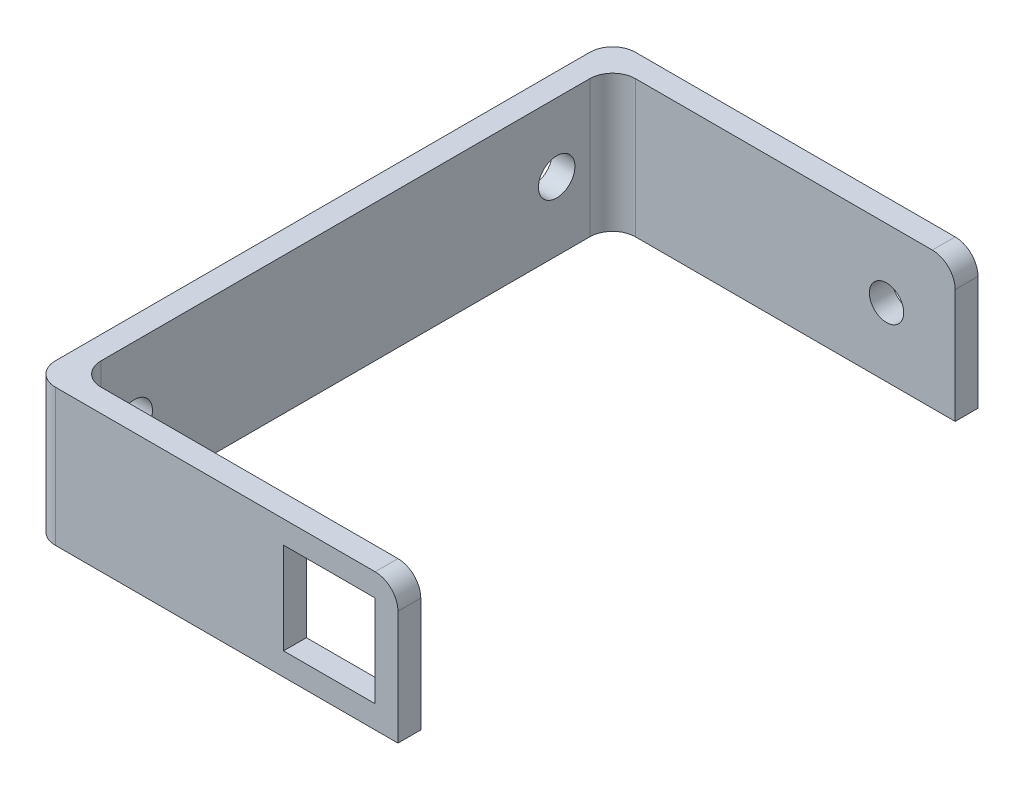
ISO-10303-21;
HEADER;
FILE_DESCRIPTION(('STEP AP214'),'2;1');
FILE_NAME('part.step','',(''),(''),'','','');
FILE_SCHEMA(('AUTOMOTIVE_DESIGN { 1 0 10303 214 1 1 1 1 }'));
ENDSEC;
DATA;
#1=APPLICATION_CONTEXT('core data for automotive mechanical design processes');
#2=APPLICATION_PROTOCOL_DEFINITION('international standard','automotive_design',2000,#1);
#3=PRODUCT_CONTEXT('',#1,'mechanical');
#4=PRODUCT('Part','Part','',(#3));
#5=PRODUCT_RELATED_PRODUCT_CATEGORY('part','',(#4));
#6=PRODUCT_DEFINITION_FORMATION('','',#4);
#7=PRODUCT_DEFINITION_CONTEXT('part definition',#1,'design');
#8=PRODUCT_DEFINITION('design','',#6,#7);
#9=PRODUCT_DEFINITION_SHAPE('','',#8);
#10=(LENGTH_UNIT() NAMED_UNIT(*) SI_UNIT(.MILLI.,.METRE.));
#11=(NAMED_UNIT(*) PLANE_ANGLE_UNIT() SI_UNIT($,.RADIAN.));
#12=(NAMED_UNIT(*) SI_UNIT($,.STERADIAN.) SOLID_ANGLE_UNIT());
#13=UNCERTAINTY_MEASURE_WITH_UNIT(LENGTH_MEASURE(1.E-05),#10,'distance_accuracy_value','');
#14=(GEOMETRIC_REPRESENTATION_CONTEXT(3) GLOBAL_UNCERTAINTY_ASSIGNED_CONTEXT((#13)) GLOBAL_UNIT_ASSIGNED_CONTEXT((#10,
#11,#12)) REPRESENTATION_CONTEXT('',''));
#15=CARTESIAN_POINT('',(0.,0.,0.));
#16=DIRECTION('',(0.,0.,1.));
#17=DIRECTION('',(1.,0.,0.));
#18=AXIS2_PLACEMENT_3D('',#15,#16,#17);
#19=CARTESIAN_POINT('',(0.,12.,-2.));
#20=DIRECTION('',(-1.,0.,0.));
#21=DIRECTION('',(0.,0.,1.));
#22=AXIS2_PLACEMENT_3D('',#19,#20,#21);
#23=PLANE('',#22);
#24=DIRECTION('',(0.,-1.,0.));
#25=VECTOR('',#24,1.);
#26=CARTESIAN_POINT('',(0.,12.,-2.));
#27=LINE('',#26,#25);
#28=CARTESIAN_POINT('',(0.,10.,-2.));
#29=VERTEX_POINT('',#28);
#30=CARTESIAN_POINT('',(0.,0.,-2.));
#31=VERTEX_POINT('',#30);
#32=EDGE_CURVE('E262',#29,#31,#27,.T.);
#33=ORIENTED_EDGE('',*,*,#32,.F.);
#34=DIRECTION('',(0.,0.,-1.));
#35=VECTOR('',#34,1.);
#36=CARTESIAN_POINT('',(0.,10.,-2.));
#37=LINE('',#36,#35);
#38=CARTESIAN_POINT('',(0.,10.,0.));
#39=VERTEX_POINT('',#38);
#40=EDGE_CURVE('E269',#29,#39,#37,.F.);
#41=ORIENTED_EDGE('',*,*,#40,.T.);
#42=DIRECTION('',(0.,-1.,0.));
#43=VECTOR('',#42,1.);
#44=CARTESIAN_POINT('',(0.,12.,0.));
#45=LINE('',#44,#43);
#46=CARTESIAN_POINT('',(0.,0.,0.));
#47=VERTEX_POINT('',#46);
#48=EDGE_CURVE('E236',#39,#47,#45,.T.);
#49=ORIENTED_EDGE('',*,*,#48,.T.);
#50=DIRECTION('',(0.,0.,-1.));
#51=VECTOR('',#50,1.);
#52=CARTESIAN_POINT('',(0.,0.,-2.));
#53=LINE('',#52,#51);
#54=EDGE_CURVE('E220',#47,#31,#53,.T.);
#55=ORIENTED_EDGE('',*,*,#54,.T.);
#56=EDGE_LOOP('',(#33,#41,#49,#55));
#57=FACE_BOUND('',#56,.T.);
#58=ADVANCED_FACE('F34',(#57),#23,.F.);
#59=CARTESIAN_POINT('',(-30.,12.,-2.));
#60=DIRECTION('',(0.,0.,1.));
#61=DIRECTION('',(1.,0.,0.));
#62=AXIS2_PLACEMENT_3D('',#59,#60,#61);
#63=PLANE('',#62);
#64=DIRECTION('',(1.,0.,0.));
#65=VECTOR('',#64,1.);
#66=CARTESIAN_POINT('',(-10.02,1.99,-2.));
#67=LINE('',#66,#65);
#68=CARTESIAN_POINT('',(-10.02,1.99,-2.));
#69=VERTEX_POINT('',#68);
#70=CARTESIAN_POINT('',(-2.,1.99,-2.));
#71=VERTEX_POINT('',#70);
#72=EDGE_CURVE('E171',#69,#71,#67,.T.);
#73=ORIENTED_EDGE('',*,*,#72,.T.);
#74=DIRECTION('',(0.,1.,0.));
#75=VECTOR('',#74,1.);
#76=CARTESIAN_POINT('',(-2.,1.99,-2.));
#77=LINE('',#76,#75);
#78=CARTESIAN_POINT('',(-2.,10.01,-2.));
#79=VERTEX_POINT('',#78);
#80=EDGE_CURVE('E163',#71,#79,#77,.T.);
#81=ORIENTED_EDGE('',*,*,#80,.T.);
#82=DIRECTION('',(-1.,0.,0.));
#83=VECTOR('',#82,1.);
#84=CARTESIAN_POINT('',(-10.02,10.01,-2.));
#85=LINE('',#84,#83);
#86=CARTESIAN_POINT('',(-10.02,10.01,-2.));
#87=VERTEX_POINT('',#86);
#88=EDGE_CURVE('E175',#79,#87,#85,.T.);
#89=ORIENTED_EDGE('',*,*,#88,.T.);
#90=DIRECTION('',(0.,-1.,0.));
#91=VECTOR('',#90,1.);
#92=CARTESIAN_POINT('',(-10.02,1.99,-2.));
#93=LINE('',#92,#91);
#94=EDGE_CURVE('E179',#87,#69,#93,.T.);
#95=ORIENTED_EDGE('',*,*,#94,.T.);
#96=EDGE_LOOP('',(#73,#81,#89,#95));
#97=FACE_BOUND('',#96,.T.);
#98=DIRECTION('',(-1.,0.,0.));
#99=VECTOR('',#98,1.);
#100=CARTESIAN_POINT('',(-30.,0.,-2.));
#101=LINE('',#100,#99);
#102=CARTESIAN_POINT('',(-28.,0.,-2.));
#103=VERTEX_POINT('',#102);
#104=EDGE_CURVE('E239',#31,#103,#101,.T.);
#105=ORIENTED_EDGE('',*,*,#104,.T.);
#106=DIRECTION('',(0.,-1.,0.));
#107=VECTOR('',#106,1.);
#108=CARTESIAN_POINT('',(-28.,12.,-2.));
#109=LINE('',#108,#107);
#110=CARTESIAN_POINT('',(-28.,12.,-2.));
#111=VERTEX_POINT('',#110);
#112=EDGE_CURVE('E287',#103,#111,#109,.F.);
#113=ORIENTED_EDGE('',*,*,#112,.T.);
#114=DIRECTION('',(-1.,0.,0.));
#115=VECTOR('',#114,1.);
#116=CARTESIAN_POINT('',(-30.,12.,-2.));
#117=LINE('',#116,#115);
#118=CARTESIAN_POINT('',(-2.,12.,-2.));
#119=VERTEX_POINT('',#118);
#120=EDGE_CURVE('E221',#119,#111,#117,.T.);
#121=ORIENTED_EDGE('',*,*,#120,.F.);
#122=CARTESIAN_POINT('',(-2.,10.,-2.));
#123=DIRECTION('',(0.,0.,1.));
#124=DIRECTION('',(1.,0.,0.));
#125=AXIS2_PLACEMENT_3D('',#122,#123,#124);
#126=CIRCLE('',#125,2.);
#127=EDGE_CURVE('E267',#119,#29,#126,.F.);
#128=ORIENTED_EDGE('',*,*,#127,.T.);
#129=ORIENTED_EDGE('',*,*,#32,.T.);
#130=EDGE_LOOP('',(#105,#113,#121,#128,#129));
#131=FACE_BOUND('',#130,.T.);
#132=ADVANCED_FACE('F181',(#97,#131),#63,.F.);
#133=CARTESIAN_POINT('',(-30.,12.,-48.8));
#134=DIRECTION('',(-1.,0.,0.));
#135=DIRECTION('',(0.,0.,1.));
#136=AXIS2_PLACEMENT_3D('',#133,#134,#135);
#137=PLANE('',#136);
#138=CARTESIAN_POINT('',(-30.,6.,-43.9));
#139=DIRECTION('',(-1.,0.,0.));
#140=DIRECTION('',(0.,0.,1.));
#141=AXIS2_PLACEMENT_3D('',#138,#139,#140);
#142=CIRCLE('',#141,1.6);
#143=CARTESIAN_POINT('',(-30.,6.,-42.3));
#144=VERTEX_POINT('',#143);
#145=EDGE_CURVE('E211',#144,#144,#142,.T.);
#146=ORIENTED_EDGE('',*,*,#145,.T.);
#147=EDGE_LOOP('',(#146));
#148=FACE_BOUND('',#147,.T.);
#149=CARTESIAN_POINT('',(-30.,6.00000000000012,-6.9));
#150=DIRECTION('',(-1.,0.,0.));
#151=DIRECTION('',(0.,0.,1.));
#152=AXIS2_PLACEMENT_3D('',#149,#150,#151);
#153=CIRCLE('',#152,1.59999999999973);
#154=CARTESIAN_POINT('',(-30.,6.00000000000012,-5.30000000000027));
#155=VERTEX_POINT('',#154);
#156=EDGE_CURVE('E206',#155,#155,#153,.T.);
#157=ORIENTED_EDGE('',*,*,#156,.T.);
#158=EDGE_LOOP('',(#157));
#159=FACE_BOUND('',#158,.T.);
#160=DIRECTION('',(0.,0.,-1.));
#161=VECTOR('',#160,1.);
#162=CARTESIAN_POINT('',(-30.,0.,-48.8));
#163=LINE('',#162,#161);
#164=CARTESIAN_POINT('',(-30.,0.,-4.));
#165=VERTEX_POINT('',#164);
#166=CARTESIAN_POINT('',(-30.,0.,-46.8));
#167=VERTEX_POINT('',#166);
#168=EDGE_CURVE('E242',#165,#167,#163,.T.);
#169=ORIENTED_EDGE('',*,*,#168,.T.);
#170=DIRECTION('',(0.,-1.,0.));
#171=VECTOR('',#170,1.);
#172=CARTESIAN_POINT('',(-30.,12.,-46.8));
#173=LINE('',#172,#171);
#174=CARTESIAN_POINT('',(-30.,12.,-46.8));
#175=VERTEX_POINT('',#174);
#176=EDGE_CURVE('E307',#167,#175,#173,.F.);
#177=ORIENTED_EDGE('',*,*,#176,.T.);
#178=DIRECTION('',(0.,0.,-1.));
#179=VECTOR('',#178,1.);
#180=CARTESIAN_POINT('',(-30.,12.,-48.8));
#181=LINE('',#180,#179);
#182=CARTESIAN_POINT('',(-30.,12.,-4.));
#183=VERTEX_POINT('',#182);
#184=EDGE_CURVE('E224',#183,#175,#181,.T.);
#185=ORIENTED_EDGE('',*,*,#184,.F.);
#186=DIRECTION('',(0.,-1.,0.));
#187=VECTOR('',#186,1.);
#188=CARTESIAN_POINT('',(-30.,0.,-4.));
#189=LINE('',#188,#187);
#190=EDGE_CURVE('E284',#183,#165,#189,.T.);
#191=ORIENTED_EDGE('',*,*,#190,.T.);
#192=EDGE_LOOP('',(#169,#177,#185,#191));
#193=FACE_BOUND('',#192,.T.);
#194=ADVANCED_FACE('F352',(#148,#159,#193),#137,.F.);
#195=CARTESIAN_POINT('',(0.,12.,-48.8));
#196=DIRECTION('',(0.,0.,-1.));
#197=DIRECTION('',(-1.,0.,0.));
#198=AXIS2_PLACEMENT_3D('',#195,#196,#197);
#199=PLANE('',#198);
#200=CARTESIAN_POINT('',(-6.01,6.,-48.8));
#201=DIRECTION('',(0.,0.,-1.));
#202=DIRECTION('',(-1.,0.,0.));
#203=AXIS2_PLACEMENT_3D('',#200,#201,#202);
#204=CIRCLE('',#203,1.505);
#205=CARTESIAN_POINT('',(-7.515,6.,-48.8));
#206=VERTEX_POINT('',#205);
#207=EDGE_CURVE('E217',#206,#206,#204,.T.);
#208=ORIENTED_EDGE('',*,*,#207,.T.);
#209=EDGE_LOOP('',(#208));
#210=FACE_BOUND('',#209,.T.);
#211=DIRECTION('',(1.,0.,0.));
#212=VECTOR('',#211,1.);
#213=CARTESIAN_POINT('',(0.,12.,-48.8));
#214=LINE('',#213,#212);
#215=CARTESIAN_POINT('',(-28.,12.,-48.8));
#216=VERTEX_POINT('',#215);
#217=CARTESIAN_POINT('',(-2.,12.,-48.8));
#218=VERTEX_POINT('',#217);
#219=EDGE_CURVE('E228',#216,#218,#214,.T.);
#220=ORIENTED_EDGE('',*,*,#219,.F.);
#221=DIRECTION('',(0.,-1.,0.));
#222=VECTOR('',#221,1.);
#223=CARTESIAN_POINT('',(-28.,0.,-48.8));
#224=LINE('',#223,#222);
#225=CARTESIAN_POINT('',(-28.,0.,-48.8));
#226=VERTEX_POINT('',#225);
#227=EDGE_CURVE('E304',#216,#226,#224,.T.);
#228=ORIENTED_EDGE('',*,*,#227,.T.);
#229=DIRECTION('',(1.,0.,0.));
#230=VECTOR('',#229,1.);
#231=CARTESIAN_POINT('',(0.,0.,-48.8));
#232=LINE('',#231,#230);
#233=CARTESIAN_POINT('',(0.,0.,-48.8));
#234=VERTEX_POINT('',#233);
#235=EDGE_CURVE('E245',#226,#234,#232,.T.);
#236=ORIENTED_EDGE('',*,*,#235,.T.);
#237=DIRECTION('',(0.,-1.,0.));
#238=VECTOR('',#237,1.);
#239=CARTESIAN_POINT('',(0.,12.,-48.8));
#240=LINE('',#239,#238);
#241=CARTESIAN_POINT('',(0.,10.,-48.8));
#242=VERTEX_POINT('',#241);
#243=EDGE_CURVE('E259',#242,#234,#240,.T.);
#244=ORIENTED_EDGE('',*,*,#243,.F.);
#245=CARTESIAN_POINT('',(-2.,10.,-48.8));
#246=DIRECTION('',(0.,0.,-1.));
#247=DIRECTION('',(-1.,0.,0.));
#248=AXIS2_PLACEMENT_3D('',#245,#246,#247);
#249=CIRCLE('',#248,2.);
#250=EDGE_CURVE('E281',#242,#218,#249,.F.);
#251=ORIENTED_EDGE('',*,*,#250,.T.);
#252=EDGE_LOOP('',(#220,#228,#236,#244,#251));
#253=FACE_BOUND('',#252,.T.);
#254=ADVANCED_FACE('F360',(#210,#253),#199,.F.);
#255=CARTESIAN_POINT('',(0.,12.,-50.8));
#256=DIRECTION('',(-1.,0.,0.));
#257=DIRECTION('',(0.,0.,1.));
#258=AXIS2_PLACEMENT_3D('',#255,#256,#257);
#259=PLANE('',#258);
#260=DIRECTION('',(0.,-1.,0.));
#261=VECTOR('',#260,1.);
#262=CARTESIAN_POINT('',(0.,12.,-50.8));
#263=LINE('',#262,#261);
#264=CARTESIAN_POINT('',(0.,10.,-50.8));
#265=VERTEX_POINT('',#264);
#266=CARTESIAN_POINT('',(0.,0.,-50.8));
#267=VERTEX_POINT('',#266);
#268=EDGE_CURVE('E257',#265,#267,#263,.T.);
#269=ORIENTED_EDGE('',*,*,#268,.F.);
#270=DIRECTION('',(0.,0.,-1.));
#271=VECTOR('',#270,1.);
#272=CARTESIAN_POINT('',(0.,10.,-50.8));
#273=LINE('',#272,#271);
#274=EDGE_CURVE('E279',#265,#242,#273,.F.);
#275=ORIENTED_EDGE('',*,*,#274,.T.);
#276=ORIENTED_EDGE('',*,*,#243,.T.);
#277=DIRECTION('',(0.,0.,-1.));
#278=VECTOR('',#277,1.);
#279=CARTESIAN_POINT('',(0.,0.,-50.8));
#280=LINE('',#279,#278);
#281=EDGE_CURVE('E247',#234,#267,#280,.T.);
#282=ORIENTED_EDGE('',*,*,#281,.T.);
#283=EDGE_LOOP('',(#269,#275,#276,#282));
#284=FACE_BOUND('',#283,.T.);
#285=ADVANCED_FACE('F371',(#284),#259,.F.);
#286=CARTESIAN_POINT('',(-32.,12.,-50.8));
#287=DIRECTION('',(0.,0.,1.));
#288=DIRECTION('',(1.,0.,0.));
#289=AXIS2_PLACEMENT_3D('',#286,#287,#288);
#290=PLANE('',#289);
#291=CARTESIAN_POINT('',(-6.01,6.,-50.8));
#292=DIRECTION('',(0.,0.,-1.));
#293=DIRECTION('',(-1.,0.,0.));
#294=AXIS2_PLACEMENT_3D('',#291,#292,#293);
#295=CIRCLE('',#294,1.505);
#296=CARTESIAN_POINT('',(-7.515,6.,-50.8));
#297=VERTEX_POINT('',#296);
#298=EDGE_CURVE('E214',#297,#297,#295,.T.);
#299=ORIENTED_EDGE('',*,*,#298,.F.);
#300=EDGE_LOOP('',(#299));
#301=FACE_BOUND('',#300,.T.);
#302=DIRECTION('',(-1.,0.,0.));
#303=VECTOR('',#302,1.);
#304=CARTESIAN_POINT('',(-32.,0.,-50.8));
#305=LINE('',#304,#303);
#306=CARTESIAN_POINT('',(-30.,0.,-50.8));
#307=VERTEX_POINT('',#306);
#308=EDGE_CURVE('E250',#267,#307,#305,.T.);
#309=ORIENTED_EDGE('',*,*,#308,.T.);
#310=DIRECTION('',(0.,-1.,0.));
#311=VECTOR('',#310,1.);
#312=CARTESIAN_POINT('',(-30.,12.,-50.8));
#313=LINE('',#312,#311);
#314=CARTESIAN_POINT('',(-30.,12.,-50.8));
#315=VERTEX_POINT('',#314);
#316=EDGE_CURVE('E42',#307,#315,#313,.F.);
#317=ORIENTED_EDGE('',*,*,#316,.T.);
#318=DIRECTION('',(-1.,0.,0.));
#319=VECTOR('',#318,1.);
#320=CARTESIAN_POINT('',(-32.,12.,-50.8));
#321=LINE('',#320,#319);
#322=CARTESIAN_POINT('',(-2.,12.,-50.8));
#323=VERTEX_POINT('',#322);
#324=EDGE_CURVE('E230',#323,#315,#321,.T.);
#325=ORIENTED_EDGE('',*,*,#324,.F.);
#326=CARTESIAN_POINT('',(-2.,10.,-50.8));
#327=DIRECTION('',(0.,0.,1.));
#328=DIRECTION('',(1.,0.,0.));
#329=AXIS2_PLACEMENT_3D('',#326,#327,#328);
#330=CIRCLE('',#329,2.);
#331=EDGE_CURVE('E277',#323,#265,#330,.F.);
#332=ORIENTED_EDGE('',*,*,#331,.T.);
#333=ORIENTED_EDGE('',*,*,#268,.T.);
#334=EDGE_LOOP('',(#309,#317,#325,#332,#333));
#335=FACE_BOUND('',#334,.T.);
#336=ADVANCED_FACE('F368',(#301,#335),#290,.F.);
#337=CARTESIAN_POINT('',(-32.,12.,0.));
#338=DIRECTION('',(1.,0.,0.));
#339=DIRECTION('',(0.,0.,-1.));
#340=AXIS2_PLACEMENT_3D('',#337,#338,#339);
#341=PLANE('',#340);
#342=CARTESIAN_POINT('',(-32.,6.,-43.9));
#343=DIRECTION('',(-1.,0.,0.));
#344=DIRECTION('',(0.,0.,1.));
#345=AXIS2_PLACEMENT_3D('',#342,#343,#344);
#346=CIRCLE('',#345,1.6);
#347=CARTESIAN_POINT('',(-32.,6.,-42.3));
#348=VERTEX_POINT('',#347);
#349=EDGE_CURVE('E203',#348,#348,#346,.T.);
#350=ORIENTED_EDGE('',*,*,#349,.F.);
#351=EDGE_LOOP('',(#350));
#352=FACE_BOUND('',#351,.T.);
#353=CARTESIAN_POINT('',(-32.,6.00000000000012,-6.9));
#354=DIRECTION('',(-1.,0.,0.));
#355=DIRECTION('',(0.,0.,1.));
#356=AXIS2_PLACEMENT_3D('',#353,#354,#355);
#357=CIRCLE('',#356,1.59999999999973);
#358=CARTESIAN_POINT('',(-32.,6.00000000000012,-5.30000000000027));
#359=VERTEX_POINT('',#358);
#360=EDGE_CURVE('E199',#359,#359,#357,.T.);
#361=ORIENTED_EDGE('',*,*,#360,.F.);
#362=EDGE_LOOP('',(#361));
#363=FACE_BOUND('',#362,.T.);
#364=DIRECTION('',(0.,0.,1.));
#365=VECTOR('',#364,1.);
#366=CARTESIAN_POINT('',(-32.,12.,0.));
#367=LINE('',#366,#365);
#368=CARTESIAN_POINT('',(-32.,12.,-48.8));
#369=VERTEX_POINT('',#368);
#370=CARTESIAN_POINT('',(-32.,12.,-2.));
#371=VERTEX_POINT('',#370);
#372=EDGE_CURVE('E232',#369,#371,#367,.T.);
#373=ORIENTED_EDGE('',*,*,#372,.F.);
#374=DIRECTION('',(0.,-1.,0.));
#375=VECTOR('',#374,1.);
#376=CARTESIAN_POINT('',(-32.,12.,-48.8));
#377=LINE('',#376,#375);
#378=CARTESIAN_POINT('',(-32.,0.,-48.8));
#379=VERTEX_POINT('',#378);
#380=EDGE_CURVE('E313',#369,#379,#377,.T.);
#381=ORIENTED_EDGE('',*,*,#380,.T.);
#382=DIRECTION('',(0.,0.,1.));
#383=VECTOR('',#382,1.);
#384=CARTESIAN_POINT('',(-32.,0.,0.));
#385=LINE('',#384,#383);
#386=CARTESIAN_POINT('',(-32.,0.,-2.));
#387=VERTEX_POINT('',#386);
#388=EDGE_CURVE('E252',#379,#387,#385,.T.);
#389=ORIENTED_EDGE('',*,*,#388,.T.);
#390=DIRECTION('',(0.,-1.,0.));
#391=VECTOR('',#390,1.);
#392=CARTESIAN_POINT('',(-32.,12.,-2.));
#393=LINE('',#392,#391);
#394=EDGE_CURVE('E299',#387,#371,#393,.F.);
#395=ORIENTED_EDGE('',*,*,#394,.T.);
#396=EDGE_LOOP('',(#373,#381,#389,#395));
#397=FACE_BOUND('',#396,.T.);
#398=ADVANCED_FACE('F319',(#352,#363,#397),#341,.F.);
#399=CARTESIAN_POINT('',(0.,12.,0.));
#400=DIRECTION('',(0.,0.,-1.));
#401=DIRECTION('',(-1.,0.,0.));
#402=AXIS2_PLACEMENT_3D('',#399,#400,#401);
#403=PLANE('',#402);
#404=DIRECTION('',(-1.,0.,0.));
#405=VECTOR('',#404,1.);
#406=CARTESIAN_POINT('',(-10.02,10.01,0.));
#407=LINE('',#406,#405);
#408=CARTESIAN_POINT('',(-2.,10.01,0.));
#409=VERTEX_POINT('',#408);
#410=CARTESIAN_POINT('',(-10.02,10.01,0.));
#411=VERTEX_POINT('',#410);
#412=EDGE_CURVE('E193',#409,#411,#407,.T.);
#413=ORIENTED_EDGE('',*,*,#412,.F.);
#414=DIRECTION('',(0.,1.,0.));
#415=VECTOR('',#414,1.);
#416=CARTESIAN_POINT('',(-2.,1.99,0.));
#417=LINE('',#416,#415);
#418=CARTESIAN_POINT('',(-2.,1.99,0.));
#419=VERTEX_POINT('',#418);
#420=EDGE_CURVE('E166',#419,#409,#417,.T.);
#421=ORIENTED_EDGE('',*,*,#420,.F.);
#422=DIRECTION('',(1.,0.,0.));
#423=VECTOR('',#422,1.);
#424=CARTESIAN_POINT('',(-10.02,1.99,0.));
#425=LINE('',#424,#423);
#426=CARTESIAN_POINT('',(-10.02,1.99,0.));
#427=VERTEX_POINT('',#426);
#428=EDGE_CURVE('E184',#427,#419,#425,.T.);
#429=ORIENTED_EDGE('',*,*,#428,.F.);
#430=DIRECTION('',(0.,-1.,0.));
#431=VECTOR('',#430,1.);
#432=CARTESIAN_POINT('',(-10.02,1.99,0.));
#433=LINE('',#432,#431);
#434=EDGE_CURVE('E187',#411,#427,#433,.T.);
#435=ORIENTED_EDGE('',*,*,#434,.F.);
#436=EDGE_LOOP('',(#413,#421,#429,#435));
#437=FACE_BOUND('',#436,.T.);
#438=DIRECTION('',(1.,0.,0.));
#439=VECTOR('',#438,1.);
#440=CARTESIAN_POINT('',(0.,12.,0.));
#441=LINE('',#440,#439);
#442=CARTESIAN_POINT('',(-30.,12.,0.));
#443=VERTEX_POINT('',#442);
#444=CARTESIAN_POINT('',(-2.,12.,0.));
#445=VERTEX_POINT('',#444);
#446=EDGE_CURVE('E234',#443,#445,#441,.T.);
#447=ORIENTED_EDGE('',*,*,#446,.F.);
#448=DIRECTION('',(0.,-1.,0.));
#449=VECTOR('',#448,1.);
#450=CARTESIAN_POINT('',(-30.,12.,0.));
#451=LINE('',#450,#449);
#452=CARTESIAN_POINT('',(-30.,0.,0.));
#453=VERTEX_POINT('',#452);
#454=EDGE_CURVE('E293',#443,#453,#451,.T.);
#455=ORIENTED_EDGE('',*,*,#454,.T.);
#456=DIRECTION('',(1.,0.,0.));
#457=VECTOR('',#456,1.);
#458=CARTESIAN_POINT('',(0.,0.,0.));
#459=LINE('',#458,#457);
#460=EDGE_CURVE('E225',#453,#47,#459,.T.);
#461=ORIENTED_EDGE('',*,*,#460,.T.);
#462=ORIENTED_EDGE('',*,*,#48,.F.);
#463=CARTESIAN_POINT('',(-2.,10.,0.));
#464=DIRECTION('',(0.,0.,-1.));
#465=DIRECTION('',(-1.,0.,0.));
#466=AXIS2_PLACEMENT_3D('',#463,#464,#465);
#467=CIRCLE('',#466,2.);
#468=EDGE_CURVE('E271',#39,#445,#467,.F.);
#469=ORIENTED_EDGE('',*,*,#468,.T.);
#470=EDGE_LOOP('',(#447,#455,#461,#462,#469));
#471=FACE_BOUND('',#470,.T.);
#472=ADVANCED_FACE('F334',(#437,#471),#403,.F.);
#473=CARTESIAN_POINT('',(0.,12.,0.));
#474=DIRECTION('',(0.,-1.,0.));
#475=DIRECTION('',(0.,0.,-1.));
#476=AXIS2_PLACEMENT_3D('',#473,#474,#475);
#477=PLANE('',#476);
#478=ORIENTED_EDGE('',*,*,#324,.T.);
#479=CARTESIAN_POINT('',(-30.,12.,-48.8));
#480=DIRECTION('',(0.,-1.,0.));
#481=DIRECTION('',(0.,0.,-1.));
#482=AXIS2_PLACEMENT_3D('',#479,#480,#481);
#483=CIRCLE('',#482,2.);
#484=EDGE_CURVE('E11',#315,#369,#483,.F.);
#485=ORIENTED_EDGE('',*,*,#484,.T.);
#486=ORIENTED_EDGE('',*,*,#372,.T.);
#487=CARTESIAN_POINT('',(-30.,12.,-2.));
#488=DIRECTION('',(0.,-1.,0.));
#489=DIRECTION('',(0.,0.,-1.));
#490=AXIS2_PLACEMENT_3D('',#487,#488,#489);
#491=CIRCLE('',#490,2.);
#492=EDGE_CURVE('E302',#371,#443,#491,.F.);
#493=ORIENTED_EDGE('',*,*,#492,.T.);
#494=ORIENTED_EDGE('',*,*,#446,.T.);
#495=DIRECTION('',(0.,0.,-1.));
#496=VECTOR('',#495,1.);
#497=CARTESIAN_POINT('',(-2.,12.,0.));
#498=LINE('',#497,#496);
#499=EDGE_CURVE('E264',#445,#119,#498,.T.);
#500=ORIENTED_EDGE('',*,*,#499,.T.);
#501=ORIENTED_EDGE('',*,*,#120,.T.);
#502=CARTESIAN_POINT('',(-28.,12.,-4.));
#503=DIRECTION('',(0.,-1.,0.));
#504=DIRECTION('',(0.,0.,-1.));
#505=AXIS2_PLACEMENT_3D('',#502,#503,#504);
#506=CIRCLE('',#505,2.);
#507=EDGE_CURVE('E291',#111,#183,#506,.T.);
#508=ORIENTED_EDGE('',*,*,#507,.T.);
#509=ORIENTED_EDGE('',*,*,#184,.T.);
#510=CARTESIAN_POINT('',(-28.,12.,-46.8));
#511=DIRECTION('',(0.,-1.,0.));
#512=DIRECTION('',(0.,0.,-1.));
#513=AXIS2_PLACEMENT_3D('',#510,#511,#512);
#514=CIRCLE('',#513,2.);
#515=EDGE_CURVE('E311',#175,#216,#514,.T.);
#516=ORIENTED_EDGE('',*,*,#515,.T.);
#517=ORIENTED_EDGE('',*,*,#219,.T.);
#518=DIRECTION('',(0.,0.,-1.));
#519=VECTOR('',#518,1.);
#520=CARTESIAN_POINT('',(-2.,12.,0.));
#521=LINE('',#520,#519);
#522=EDGE_CURVE('E274',#218,#323,#521,.T.);
#523=ORIENTED_EDGE('',*,*,#522,.T.);
#524=EDGE_LOOP('',(#478,#485,#486,#493,#494,#500,#501,#508,#509,#516,#517,#523));
#525=FACE_BOUND('',#524,.T.);
#526=ADVANCED_FACE('F332',(#525),#477,.F.);
#527=CARTESIAN_POINT('',(0.,0.,0.));
#528=DIRECTION('',(0.,-1.,0.));
#529=DIRECTION('',(0.,0.,-1.));
#530=AXIS2_PLACEMENT_3D('',#527,#528,#529);
#531=PLANE('',#530);
#532=ORIENTED_EDGE('',*,*,#388,.F.);
#533=CARTESIAN_POINT('',(-30.,0.,-48.8));
#534=DIRECTION('',(0.,-1.,0.));
#535=DIRECTION('',(0.,0.,-1.));
#536=AXIS2_PLACEMENT_3D('',#533,#534,#535);
#537=CIRCLE('',#536,2.);
#538=EDGE_CURVE('E56',#379,#307,#537,.T.);
#539=ORIENTED_EDGE('',*,*,#538,.T.);
#540=ORIENTED_EDGE('',*,*,#308,.F.);
#541=ORIENTED_EDGE('',*,*,#281,.F.);
#542=ORIENTED_EDGE('',*,*,#235,.F.);
#543=CARTESIAN_POINT('',(-28.,0.,-46.8));
#544=DIRECTION('',(0.,-1.,0.));
#545=DIRECTION('',(0.,0.,-1.));
#546=AXIS2_PLACEMENT_3D('',#543,#544,#545);
#547=CIRCLE('',#546,2.);
#548=EDGE_CURVE('E309',#226,#167,#547,.F.);
#549=ORIENTED_EDGE('',*,*,#548,.T.);
#550=ORIENTED_EDGE('',*,*,#168,.F.);
#551=CARTESIAN_POINT('',(-28.,0.,-4.));
#552=DIRECTION('',(0.,-1.,0.));
#553=DIRECTION('',(0.,0.,-1.));
#554=AXIS2_PLACEMENT_3D('',#551,#552,#553);
#555=CIRCLE('',#554,2.);
#556=EDGE_CURVE('E289',#165,#103,#555,.F.);
#557=ORIENTED_EDGE('',*,*,#556,.T.);
#558=ORIENTED_EDGE('',*,*,#104,.F.);
#559=ORIENTED_EDGE('',*,*,#54,.F.);
#560=ORIENTED_EDGE('',*,*,#460,.F.);
#561=CARTESIAN_POINT('',(-30.,0.,-2.));
#562=DIRECTION('',(0.,-1.,0.));
#563=DIRECTION('',(0.,0.,-1.));
#564=AXIS2_PLACEMENT_3D('',#561,#562,#563);
#565=CIRCLE('',#564,2.);
#566=EDGE_CURVE('E296',#453,#387,#565,.T.);
#567=ORIENTED_EDGE('',*,*,#566,.T.);
#568=EDGE_LOOP('',(#532,#539,#540,#541,#542,#549,#550,#557,#558,#559,#560,#567));
#569=FACE_BOUND('',#568,.T.);
#570=ADVANCED_FACE('F322',(#569),#531,.T.);
#571=CARTESIAN_POINT('',(-6.01,6.,-46.8));
#572=DIRECTION('',(0.,0.,-1.));
#573=DIRECTION('',(-1.,0.,0.));
#574=AXIS2_PLACEMENT_3D('',#571,#572,#573);
#575=CYLINDRICAL_SURFACE('',#574,1.505);
#576=ORIENTED_EDGE('',*,*,#298,.T.);
#577=EDGE_LOOP('',(#576));
#578=FACE_BOUND('',#577,.T.);
#579=ORIENTED_EDGE('',*,*,#207,.F.);
#580=EDGE_LOOP('',(#579));
#581=FACE_BOUND('',#580,.T.);
#582=ADVANCED_FACE('F446',(#578,#581),#575,.F.);
#583=CARTESIAN_POINT('',(-28.,6.00000000000012,-6.9));
#584=DIRECTION('',(-1.,0.,0.));
#585=DIRECTION('',(0.,0.,1.));
#586=AXIS2_PLACEMENT_3D('',#583,#584,#585);
#587=CYLINDRICAL_SURFACE('',#586,1.59999999999973);
#588=ORIENTED_EDGE('',*,*,#360,.T.);
#589=EDGE_LOOP('',(#588));
#590=FACE_BOUND('',#589,.T.);
#591=ORIENTED_EDGE('',*,*,#156,.F.);
#592=EDGE_LOOP('',(#591));
#593=FACE_BOUND('',#592,.T.);
#594=ADVANCED_FACE('F459',(#590,#593),#587,.F.);
#595=CARTESIAN_POINT('',(-28.,6.,-43.9));
#596=DIRECTION('',(-1.,0.,0.));
#597=DIRECTION('',(0.,0.,1.));
#598=AXIS2_PLACEMENT_3D('',#595,#596,#597);
#599=CYLINDRICAL_SURFACE('',#598,1.6);
#600=ORIENTED_EDGE('',*,*,#349,.T.);
#601=EDGE_LOOP('',(#600));
#602=FACE_BOUND('',#601,.T.);
#603=ORIENTED_EDGE('',*,*,#145,.F.);
#604=EDGE_LOOP('',(#603));
#605=FACE_BOUND('',#604,.T.);
#606=ADVANCED_FACE('F466',(#602,#605),#599,.F.);
#607=CARTESIAN_POINT('',(-2.,1.99,-2.));
#608=DIRECTION('',(1.,0.,0.));
#609=DIRECTION('',(0.,0.,-1.));
#610=AXIS2_PLACEMENT_3D('',#607,#608,#609);
#611=PLANE('',#610);
#612=ORIENTED_EDGE('',*,*,#420,.T.);
#613=DIRECTION('',(0.,0.,1.));
#614=VECTOR('',#613,1.);
#615=CARTESIAN_POINT('',(-2.,10.01,-2.));
#616=LINE('',#615,#614);
#617=EDGE_CURVE('E159',#79,#409,#616,.T.);
#618=ORIENTED_EDGE('',*,*,#617,.F.);
#619=ORIENTED_EDGE('',*,*,#80,.F.);
#620=DIRECTION('',(0.,0.,1.));
#621=VECTOR('',#620,1.);
#622=CARTESIAN_POINT('',(-2.,1.99,-2.));
#623=LINE('',#622,#621);
#624=EDGE_CURVE('E197',#71,#419,#623,.T.);
#625=ORIENTED_EDGE('',*,*,#624,.T.);
#626=EDGE_LOOP('',(#612,#618,#619,#625));
#627=FACE_BOUND('',#626,.T.);
#628=ADVANCED_FACE('F161',(#627),#611,.F.);
#629=CARTESIAN_POINT('',(-10.02,1.99,-2.));
#630=DIRECTION('',(0.,-1.,0.));
#631=DIRECTION('',(0.,0.,-1.));
#632=AXIS2_PLACEMENT_3D('',#629,#630,#631);
#633=PLANE('',#632);
#634=ORIENTED_EDGE('',*,*,#428,.T.);
#635=ORIENTED_EDGE('',*,*,#624,.F.);
#636=ORIENTED_EDGE('',*,*,#72,.F.);
#637=DIRECTION('',(0.,0.,1.));
#638=VECTOR('',#637,1.);
#639=CARTESIAN_POINT('',(-10.02,1.99,-2.));
#640=LINE('',#639,#638);
#641=EDGE_CURVE('E200',#69,#427,#640,.T.);
#642=ORIENTED_EDGE('',*,*,#641,.T.);
#643=EDGE_LOOP('',(#634,#635,#636,#642));
#644=FACE_BOUND('',#643,.T.);
#645=ADVANCED_FACE('F481',(#644),#633,.F.);
#646=CARTESIAN_POINT('',(-10.02,1.99,-2.));
#647=DIRECTION('',(-1.,0.,0.));
#648=DIRECTION('',(0.,0.,1.));
#649=AXIS2_PLACEMENT_3D('',#646,#647,#648);
#650=PLANE('',#649);
#651=ORIENTED_EDGE('',*,*,#434,.T.);
#652=ORIENTED_EDGE('',*,*,#641,.F.);
#653=ORIENTED_EDGE('',*,*,#94,.F.);
#654=DIRECTION('',(0.,0.,1.));
#655=VECTOR('',#654,1.);
#656=CARTESIAN_POINT('',(-10.02,10.01,-2.));
#657=LINE('',#656,#655);
#658=EDGE_CURVE('E170',#87,#411,#657,.T.);
#659=ORIENTED_EDGE('',*,*,#658,.T.);
#660=EDGE_LOOP('',(#651,#652,#653,#659));
#661=FACE_BOUND('',#660,.T.);
#662=ADVANCED_FACE('F488',(#661),#650,.F.);
#663=CARTESIAN_POINT('',(-10.02,10.01,-2.));
#664=DIRECTION('',(0.,1.,0.));
#665=DIRECTION('',(0.,0.,1.));
#666=AXIS2_PLACEMENT_3D('',#663,#664,#665);
#667=PLANE('',#666);
#668=ORIENTED_EDGE('',*,*,#412,.T.);
#669=ORIENTED_EDGE('',*,*,#658,.F.);
#670=ORIENTED_EDGE('',*,*,#88,.F.);
#671=ORIENTED_EDGE('',*,*,#617,.T.);
#672=EDGE_LOOP('',(#668,#669,#670,#671));
#673=FACE_BOUND('',#672,.T.);
#674=ADVANCED_FACE('F176',(#673),#667,.F.);
#675=CARTESIAN_POINT('',(-2.,10.,0.));
#676=DIRECTION('',(0.,0.,-1.));
#677=DIRECTION('',(-1.,0.,0.));
#678=AXIS2_PLACEMENT_3D('',#675,#676,#677);
#679=CYLINDRICAL_SURFACE('',#678,2.);
#680=ORIENTED_EDGE('',*,*,#468,.F.);
#681=ORIENTED_EDGE('',*,*,#40,.F.);
#682=ORIENTED_EDGE('',*,*,#127,.F.);
#683=ORIENTED_EDGE('',*,*,#499,.F.);
#684=EDGE_LOOP('',(#680,#681,#682,#683));
#685=FACE_BOUND('',#684,.T.);
#686=ADVANCED_FACE('F340',(#685),#679,.T.);
#687=CARTESIAN_POINT('',(-2.,10.,0.));
#688=DIRECTION('',(0.,0.,-1.));
#689=DIRECTION('',(-1.,0.,0.));
#690=AXIS2_PLACEMENT_3D('',#687,#688,#689);
#691=CYLINDRICAL_SURFACE('',#690,2.);
#692=ORIENTED_EDGE('',*,*,#250,.F.);
#693=ORIENTED_EDGE('',*,*,#274,.F.);
#694=ORIENTED_EDGE('',*,*,#331,.F.);
#695=ORIENTED_EDGE('',*,*,#522,.F.);
#696=EDGE_LOOP('',(#692,#693,#694,#695));
#697=FACE_BOUND('',#696,.T.);
#698=ADVANCED_FACE('F367',(#697),#691,.T.);
#699=CARTESIAN_POINT('',(-28.,12.,-4.));
#700=DIRECTION('',(0.,1.,0.));
#701=DIRECTION('',(0.,0.,1.));
#702=AXIS2_PLACEMENT_3D('',#699,#700,#701);
#703=CYLINDRICAL_SURFACE('',#702,2.);
#704=ORIENTED_EDGE('',*,*,#507,.F.);
#705=ORIENTED_EDGE('',*,*,#112,.F.);
#706=ORIENTED_EDGE('',*,*,#556,.F.);
#707=ORIENTED_EDGE('',*,*,#190,.F.);
#708=EDGE_LOOP('',(#704,#705,#706,#707));
#709=FACE_BOUND('',#708,.T.);
#710=ADVANCED_FACE('F347',(#709),#703,.F.);
#711=CARTESIAN_POINT('',(-30.,12.,-2.));
#712=DIRECTION('',(0.,-1.,0.));
#713=DIRECTION('',(0.,0.,-1.));
#714=AXIS2_PLACEMENT_3D('',#711,#712,#713);
#715=CYLINDRICAL_SURFACE('',#714,2.);
#716=ORIENTED_EDGE('',*,*,#492,.F.);
#717=ORIENTED_EDGE('',*,*,#394,.F.);
#718=ORIENTED_EDGE('',*,*,#566,.F.);
#719=ORIENTED_EDGE('',*,*,#454,.F.);
#720=EDGE_LOOP('',(#716,#717,#718,#719));
#721=FACE_BOUND('',#720,.T.);
#722=ADVANCED_FACE('F329',(#721),#715,.T.);
#723=CARTESIAN_POINT('',(-28.,12.,-46.8));
#724=DIRECTION('',(0.,1.,0.));
#725=DIRECTION('',(0.,0.,1.));
#726=AXIS2_PLACEMENT_3D('',#723,#724,#725);
#727=CYLINDRICAL_SURFACE('',#726,2.);
#728=ORIENTED_EDGE('',*,*,#515,.F.);
#729=ORIENTED_EDGE('',*,*,#176,.F.);
#730=ORIENTED_EDGE('',*,*,#548,.F.);
#731=ORIENTED_EDGE('',*,*,#227,.F.);
#732=EDGE_LOOP('',(#728,#729,#730,#731));
#733=FACE_BOUND('',#732,.T.);
#734=ADVANCED_FACE('F356',(#733),#727,.F.);
#735=CARTESIAN_POINT('',(-30.,12.,-48.8));
#736=DIRECTION('',(0.,-1.,0.));
#737=DIRECTION('',(0.,0.,-1.));
#738=AXIS2_PLACEMENT_3D('',#735,#736,#737);
#739=CYLINDRICAL_SURFACE('',#738,2.);
#740=ORIENTED_EDGE('',*,*,#484,.F.);
#741=ORIENTED_EDGE('',*,*,#316,.F.);
#742=ORIENTED_EDGE('',*,*,#538,.F.);
#743=ORIENTED_EDGE('',*,*,#380,.F.);
#744=EDGE_LOOP('',(#740,#741,#742,#743));
#745=FACE_BOUND('',#744,.T.);
#746=ADVANCED_FACE('F36',(#745),#739,.T.);
#747=CLOSED_SHELL('',(#58,#132,#194,#254,#285,#336,#398,#472,#526,#570,#582,#594,#606,#628,#645,
#662,#674,#686,#698,#710,#722,#734,#746));
#748=MANIFOLD_SOLID_BREP('B2',#747);
#749=ADVANCED_BREP_SHAPE_REPRESENTATION('',(#18,#748),#14);
#750=SHAPE_DEFINITION_REPRESENTATION(#9,#749);
ENDSEC;
END-ISO-10303-21;
